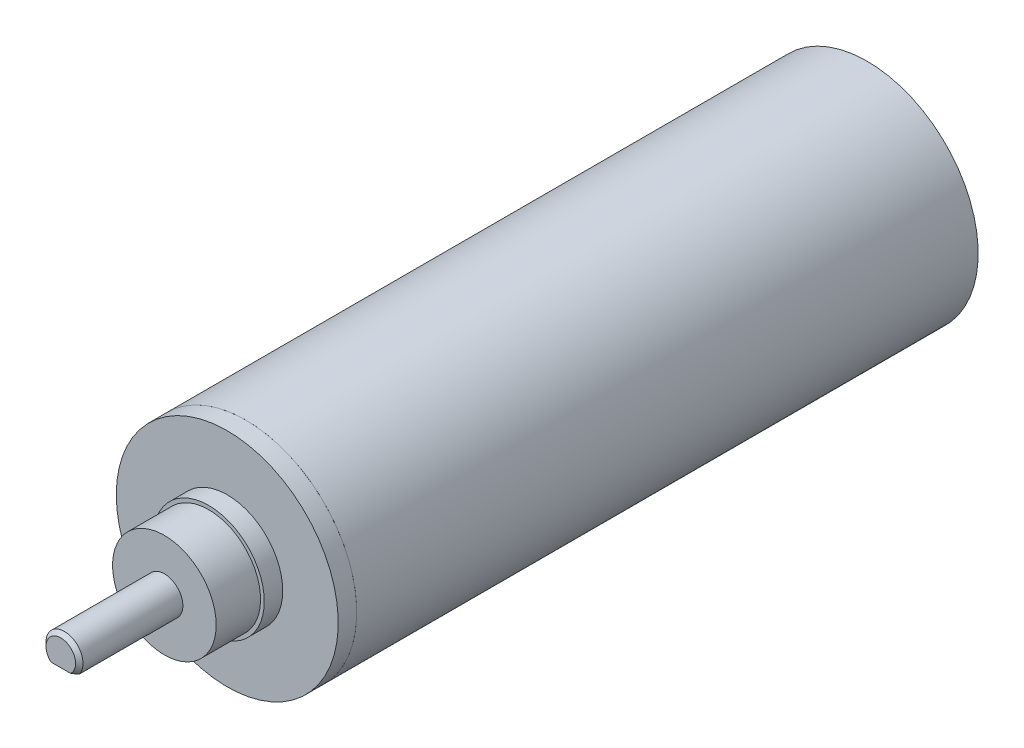
ISO-10303-21;
HEADER;
FILE_DESCRIPTION(('STEP AP214'),'2;1');
FILE_NAME('part.step','',(''),(''),'','','');
FILE_SCHEMA(('AUTOMOTIVE_DESIGN { 1 0 10303 214 1 1 1 1 }'));
ENDSEC;
DATA;
#1=APPLICATION_CONTEXT('core data for automotive mechanical design processes');
#2=APPLICATION_PROTOCOL_DEFINITION('international standard','automotive_design',2000,#1);
#3=PRODUCT_CONTEXT('',#1,'mechanical');
#4=PRODUCT('Part','Part','',(#3));
#5=PRODUCT_RELATED_PRODUCT_CATEGORY('part','',(#4));
#6=PRODUCT_DEFINITION_FORMATION('','',#4);
#7=PRODUCT_DEFINITION_CONTEXT('part definition',#1,'design');
#8=PRODUCT_DEFINITION('design','',#6,#7);
#9=PRODUCT_DEFINITION_SHAPE('','',#8);
#10=(LENGTH_UNIT() NAMED_UNIT(*) SI_UNIT(.MILLI.,.METRE.));
#11=(NAMED_UNIT(*) PLANE_ANGLE_UNIT() SI_UNIT($,.RADIAN.));
#12=(NAMED_UNIT(*) SI_UNIT($,.STERADIAN.) SOLID_ANGLE_UNIT());
#13=UNCERTAINTY_MEASURE_WITH_UNIT(LENGTH_MEASURE(1.E-05),#10,'distance_accuracy_value','');
#14=(GEOMETRIC_REPRESENTATION_CONTEXT(3) GLOBAL_UNCERTAINTY_ASSIGNED_CONTEXT((#13)) GLOBAL_UNIT_ASSIGNED_CONTEXT((#10,
#11,#12)) REPRESENTATION_CONTEXT('',''));
#15=CARTESIAN_POINT('',(0.,0.,0.));
#16=DIRECTION('',(0.,0.,1.));
#17=DIRECTION('',(1.,0.,0.));
#18=AXIS2_PLACEMENT_3D('',#15,#16,#17);
#19=CARTESIAN_POINT('',(0.,0.,-13.4));
#20=DIRECTION('',(0.,0.,1.));
#21=DIRECTION('',(1.,0.,0.));
#22=AXIS2_PLACEMENT_3D('',#19,#20,#21);
#23=CYLINDRICAL_SURFACE('',#22,1.4);
#24=CARTESIAN_POINT('',(0.,0.,-14.4919408480311));
#25=DIRECTION('',(0.,0.,1.));
#26=DIRECTION('',(-1.,0.,0.));
#27=AXIS2_PLACEMENT_3D('',#24,#25,#26);
#28=CIRCLE('',#27,1.4);
#29=CARTESIAN_POINT('',(-1.4,0.,-14.4919408480311));
#30=VERTEX_POINT('',#29);
#31=EDGE_CURVE('E39',#30,#30,#28,.T.);
#32=ORIENTED_EDGE('',*,*,#31,.F.);
#33=EDGE_LOOP('',(#32));
#34=FACE_BOUND('',#33,.T.);
#35=CARTESIAN_POINT('',(0.,0.,-13.5));
#36=DIRECTION('',(0.,0.,-1.));
#37=DIRECTION('',(1.,0.,0.));
#38=AXIS2_PLACEMENT_3D('',#35,#36,#37);
#39=CIRCLE('',#38,1.4);
#40=CARTESIAN_POINT('',(1.4,0.,-13.5));
#41=VERTEX_POINT('',#40);
#42=EDGE_CURVE('E195',#41,#41,#39,.T.);
#43=ORIENTED_EDGE('',*,*,#42,.F.);
#44=EDGE_LOOP('',(#43));
#45=FACE_BOUND('',#44,.T.);
#46=ADVANCED_FACE('F16',(#34,#45),#23,.F.);
#47=CARTESIAN_POINT('',(0.,0.,4.5));
#48=DIRECTION('',(0.,0.,-1.));
#49=DIRECTION('',(0.,-1.,0.));
#50=AXIS2_PLACEMENT_3D('',#47,#48,#49);
#51=PLANE('',#50);
#52=DIRECTION('',(-1.,0.,0.));
#53=VECTOR('',#52,1.);
#54=CARTESIAN_POINT('',(0.5,-0.3,4.5));
#55=LINE('',#54,#53);
#56=CARTESIAN_POINT('',(0.264575131106459,-0.3,4.5));
#57=VERTEX_POINT('',#56);
#58=CARTESIAN_POINT('',(-0.264575131106459,-0.3,4.5));
#59=VERTEX_POINT('',#58);
#60=EDGE_CURVE('E91',#57,#59,#55,.T.);
#61=ORIENTED_EDGE('',*,*,#60,.F.);
#62=CARTESIAN_POINT('',(0.,0.,4.5));
#63=DIRECTION('',(0.,0.,1.));
#64=DIRECTION('',(-1.,0.,0.));
#65=AXIS2_PLACEMENT_3D('',#62,#63,#64);
#66=CIRCLE('',#65,0.4);
#67=EDGE_CURVE('E11',#57,#59,#66,.T.);
#68=ORIENTED_EDGE('',*,*,#67,.T.);
#69=EDGE_LOOP('',(#61,#68));
#70=FACE_BOUND('',#69,.T.);
#71=ADVANCED_FACE('F343',(#70),#51,.F.);
#72=CARTESIAN_POINT('',(0.,0.,0.));
#73=DIRECTION('',(0.,0.,-1.));
#74=DIRECTION('',(-1.,0.,0.));
#75=AXIS2_PLACEMENT_3D('',#72,#73,#74);
#76=CYLINDRICAL_SURFACE('',#75,3.);
#77=CARTESIAN_POINT('',(0.,0.,0.));
#78=DIRECTION('',(0.,0.,-1.));
#79=DIRECTION('',(-1.,0.,0.));
#80=AXIS2_PLACEMENT_3D('',#77,#78,#79);
#81=CIRCLE('',#80,3.);
#82=CARTESIAN_POINT('',(-3.,0.,0.));
#83=VERTEX_POINT('',#82);
#84=EDGE_CURVE('E27',#83,#83,#81,.T.);
#85=ORIENTED_EDGE('',*,*,#84,.T.);
#86=EDGE_LOOP('',(#85));
#87=FACE_BOUND('',#86,.T.);
#88=CARTESIAN_POINT('',(0.,0.,-0.499));
#89=DIRECTION('',(0.,0.,1.));
#90=DIRECTION('',(-1.,0.,0.));
#91=AXIS2_PLACEMENT_3D('',#88,#89,#90);
#92=CIRCLE('',#91,3.);
#93=CARTESIAN_POINT('',(-3.,0.,-0.499));
#94=VERTEX_POINT('',#93);
#95=EDGE_CURVE('E217',#94,#94,#92,.T.);
#96=ORIENTED_EDGE('',*,*,#95,.T.);
#97=EDGE_LOOP('',(#96));
#98=FACE_BOUND('',#97,.T.);
#99=ADVANCED_FACE('F345',(#87,#98),#76,.T.);
#100=CARTESIAN_POINT('',(0.,0.,0.5));
#101=DIRECTION('',(0.,0.,1.));
#102=DIRECTION('',(1.,0.,0.));
#103=AXIS2_PLACEMENT_3D('',#100,#101,#102);
#104=PLANE('',#103);
#105=CARTESIAN_POINT('',(0.,0.,0.5));
#106=DIRECTION('',(0.,0.,1.));
#107=DIRECTION('',(1.,0.,0.));
#108=AXIS2_PLACEMENT_3D('',#105,#106,#107);
#109=CIRCLE('',#108,1.4);
#110=CARTESIAN_POINT('',(1.4,0.,0.5));
#111=VERTEX_POINT('',#110);
#112=EDGE_CURVE('E232',#111,#111,#109,.T.);
#113=ORIENTED_EDGE('',*,*,#112,.F.);
#114=EDGE_LOOP('',(#113));
#115=FACE_BOUND('',#114,.T.);
#116=CARTESIAN_POINT('',(0.,0.,0.5));
#117=DIRECTION('',(0.,0.,-1.));
#118=DIRECTION('',(-1.,0.,0.));
#119=AXIS2_PLACEMENT_3D('',#116,#117,#118);
#120=CIRCLE('',#119,1.5);
#121=CARTESIAN_POINT('',(-1.5,0.,0.5));
#122=VERTEX_POINT('',#121);
#123=EDGE_CURVE('E221',#122,#122,#120,.T.);
#124=ORIENTED_EDGE('',*,*,#123,.F.);
#125=EDGE_LOOP('',(#124));
#126=FACE_BOUND('',#125,.T.);
#127=ADVANCED_FACE('F352',(#115,#126),#104,.T.);
#128=CARTESIAN_POINT('',(0.,0.,0.));
#129=DIRECTION('',(0.,0.,1.));
#130=DIRECTION('',(1.,0.,0.));
#131=AXIS2_PLACEMENT_3D('',#128,#129,#130);
#132=CYLINDRICAL_SURFACE('',#131,1.5);
#133=ORIENTED_EDGE('',*,*,#123,.T.);
#134=EDGE_LOOP('',(#133));
#135=FACE_BOUND('',#134,.T.);
#136=CARTESIAN_POINT('',(0.,0.,0.));
#137=DIRECTION('',(0.,0.,-1.));
#138=DIRECTION('',(1.,0.,0.));
#139=AXIS2_PLACEMENT_3D('',#136,#137,#138);
#140=CIRCLE('',#139,1.5);
#141=CARTESIAN_POINT('',(1.5,0.,0.));
#142=VERTEX_POINT('',#141);
#143=EDGE_CURVE('E239',#142,#142,#140,.T.);
#144=ORIENTED_EDGE('',*,*,#143,.F.);
#145=EDGE_LOOP('',(#144));
#146=FACE_BOUND('',#145,.T.);
#147=ADVANCED_FACE('F358',(#135,#146),#132,.T.);
#148=CARTESIAN_POINT('',(0.,0.,0.));
#149=DIRECTION('',(0.,0.,1.));
#150=DIRECTION('',(1.,0.,0.));
#151=AXIS2_PLACEMENT_3D('',#148,#149,#150);
#152=PLANE('',#151);
#153=ORIENTED_EDGE('',*,*,#143,.T.);
#154=EDGE_LOOP('',(#153));
#155=FACE_BOUND('',#154,.T.);
#156=ORIENTED_EDGE('',*,*,#84,.F.);
#157=EDGE_LOOP('',(#156));
#158=FACE_BOUND('',#157,.T.);
#159=ADVANCED_FACE('F359',(#155,#158),#152,.T.);
#160=CARTESIAN_POINT('',(0.,0.,-0.4995));
#161=DIRECTION('',(0.,0.,-1.));
#162=DIRECTION('',(-1.,0.,0.));
#163=AXIS2_PLACEMENT_3D('',#160,#161,#162);
#164=CYLINDRICAL_SURFACE('',#163,2.995);
#165=CARTESIAN_POINT('',(0.,0.,-0.5));
#166=DIRECTION('',(0.,0.,-1.));
#167=DIRECTION('',(-1.,0.,0.));
#168=AXIS2_PLACEMENT_3D('',#165,#166,#167);
#169=CIRCLE('',#168,2.995);
#170=CARTESIAN_POINT('',(-2.995,0.,-0.5));
#171=VERTEX_POINT('',#170);
#172=EDGE_CURVE('E183',#171,#171,#169,.T.);
#173=ORIENTED_EDGE('',*,*,#172,.F.);
#174=EDGE_LOOP('',(#173));
#175=FACE_BOUND('',#174,.T.);
#176=CARTESIAN_POINT('',(0.,0.,-0.499));
#177=DIRECTION('',(0.,0.,-1.));
#178=DIRECTION('',(-1.,0.,0.));
#179=AXIS2_PLACEMENT_3D('',#176,#177,#178);
#180=CIRCLE('',#179,2.995);
#181=CARTESIAN_POINT('',(-2.995,0.,-0.499));
#182=VERTEX_POINT('',#181);
#183=EDGE_CURVE('E181',#182,#182,#180,.T.);
#184=ORIENTED_EDGE('',*,*,#183,.T.);
#185=EDGE_LOOP('',(#184));
#186=FACE_BOUND('',#185,.T.);
#187=ADVANCED_FACE('F362',(#175,#186),#164,.T.);
#188=CARTESIAN_POINT('',(0.,0.,-0.499));
#189=DIRECTION('',(0.,0.,-1.));
#190=DIRECTION('',(0.,-1.,0.));
#191=AXIS2_PLACEMENT_3D('',#188,#189,#190);
#192=PLANE('',#191);
#193=ORIENTED_EDGE('',*,*,#95,.F.);
#194=EDGE_LOOP('',(#193));
#195=FACE_BOUND('',#194,.T.);
#196=ORIENTED_EDGE('',*,*,#183,.F.);
#197=EDGE_LOOP('',(#196));
#198=FACE_BOUND('',#197,.T.);
#199=ADVANCED_FACE('F366',(#195,#198),#192,.T.);
#200=CARTESIAN_POINT('',(0.,0.,-0.5));
#201=DIRECTION('',(0.,0.,-1.));
#202=DIRECTION('',(0.,-1.,0.));
#203=AXIS2_PLACEMENT_3D('',#200,#201,#202);
#204=PLANE('',#203);
#205=CARTESIAN_POINT('',(0.,0.,-0.5));
#206=DIRECTION('',(0.,0.,1.));
#207=DIRECTION('',(-1.,0.,0.));
#208=AXIS2_PLACEMENT_3D('',#205,#206,#207);
#209=CIRCLE('',#208,3.);
#210=CARTESIAN_POINT('',(-3.,0.,-0.5));
#211=VERTEX_POINT('',#210);
#212=EDGE_CURVE('E186',#211,#211,#209,.T.);
#213=ORIENTED_EDGE('',*,*,#212,.T.);
#214=EDGE_LOOP('',(#213));
#215=FACE_BOUND('',#214,.T.);
#216=ORIENTED_EDGE('',*,*,#172,.T.);
#217=EDGE_LOOP('',(#216));
#218=FACE_BOUND('',#217,.T.);
#219=ADVANCED_FACE('F412',(#215,#218),#204,.F.);
#220=CARTESIAN_POINT('',(0.,0.,-17.3));
#221=DIRECTION('',(0.,0.,-1.));
#222=DIRECTION('',(0.,-1.,0.));
#223=AXIS2_PLACEMENT_3D('',#220,#221,#222);
#224=PLANE('',#223);
#225=CARTESIAN_POINT('',(0.,0.,-17.3));
#226=DIRECTION('',(0.,0.,-1.));
#227=DIRECTION('',(-1.,0.,0.));
#228=AXIS2_PLACEMENT_3D('',#225,#226,#227);
#229=CIRCLE('',#228,2.5);
#230=CARTESIAN_POINT('',(-2.5,0.,-17.3));
#231=VERTEX_POINT('',#230);
#232=EDGE_CURVE('E164',#231,#231,#229,.T.);
#233=ORIENTED_EDGE('',*,*,#232,.F.);
#234=EDGE_LOOP('',(#233));
#235=FACE_BOUND('',#234,.T.);
#236=CARTESIAN_POINT('',(0.,0.,-17.3));
#237=DIRECTION('',(0.,0.,-1.));
#238=DIRECTION('',(-1.,0.,0.));
#239=AXIS2_PLACEMENT_3D('',#236,#237,#238);
#240=CIRCLE('',#239,3.);
#241=CARTESIAN_POINT('',(-3.,0.,-17.3));
#242=VERTEX_POINT('',#241);
#243=EDGE_CURVE('E187',#242,#242,#240,.T.);
#244=ORIENTED_EDGE('',*,*,#243,.T.);
#245=EDGE_LOOP('',(#244));
#246=FACE_BOUND('',#245,.T.);
#247=ADVANCED_FACE('F165',(#235,#246),#224,.T.);
#248=CARTESIAN_POINT('',(0.,0.,0.));
#249=DIRECTION('',(0.,0.,-1.));
#250=DIRECTION('',(-1.,0.,0.));
#251=AXIS2_PLACEMENT_3D('',#248,#249,#250);
#252=CYLINDRICAL_SURFACE('',#251,3.);
#253=ORIENTED_EDGE('',*,*,#212,.F.);
#254=EDGE_LOOP('',(#253));
#255=FACE_BOUND('',#254,.T.);
#256=ORIENTED_EDGE('',*,*,#243,.F.);
#257=EDGE_LOOP('',(#256));
#258=FACE_BOUND('',#257,.T.);
#259=ADVANCED_FACE('F447',(#255,#258),#252,.T.);
#260=CARTESIAN_POINT('',(0.,0.,1.7));
#261=DIRECTION('',(0.,0.,1.));
#262=DIRECTION('',(1.,0.,0.));
#263=AXIS2_PLACEMENT_3D('',#260,#261,#262);
#264=PLANE('',#263);
#265=CARTESIAN_POINT('',(0.,0.,1.7));
#266=DIRECTION('',(0.,0.,1.));
#267=DIRECTION('',(1.,0.,0.));
#268=AXIS2_PLACEMENT_3D('',#265,#266,#267);
#269=CIRCLE('',#268,0.5);
#270=CARTESIAN_POINT('',(0.5,0.,1.7));
#271=VERTEX_POINT('',#270);
#272=EDGE_CURVE('E233',#271,#271,#269,.T.);
#273=ORIENTED_EDGE('',*,*,#272,.F.);
#274=EDGE_LOOP('',(#273));
#275=FACE_BOUND('',#274,.T.);
#276=CARTESIAN_POINT('',(0.,0.,1.7));
#277=DIRECTION('',(0.,0.,1.));
#278=DIRECTION('',(1.,0.,0.));
#279=AXIS2_PLACEMENT_3D('',#276,#277,#278);
#280=CIRCLE('',#279,1.4);
#281=CARTESIAN_POINT('',(1.4,0.,1.7));
#282=VERTEX_POINT('',#281);
#283=EDGE_CURVE('E228',#282,#282,#280,.T.);
#284=ORIENTED_EDGE('',*,*,#283,.T.);
#285=EDGE_LOOP('',(#284));
#286=FACE_BOUND('',#285,.T.);
#287=ADVANCED_FACE('F425',(#275,#286),#264,.T.);
#288=CARTESIAN_POINT('',(0.,0.,0.));
#289=DIRECTION('',(0.,0.,1.));
#290=DIRECTION('',(1.,0.,0.));
#291=AXIS2_PLACEMENT_3D('',#288,#289,#290);
#292=CYLINDRICAL_SURFACE('',#291,1.4);
#293=ORIENTED_EDGE('',*,*,#112,.T.);
#294=EDGE_LOOP('',(#293));
#295=FACE_BOUND('',#294,.T.);
#296=ORIENTED_EDGE('',*,*,#283,.F.);
#297=EDGE_LOOP('',(#296));
#298=FACE_BOUND('',#297,.T.);
#299=ADVANCED_FACE('F423',(#295,#298),#292,.T.);
#300=CARTESIAN_POINT('',(0.,0.,4.5));
#301=DIRECTION('',(0.,0.,-1.));
#302=DIRECTION('',(-1.,0.,0.));
#303=AXIS2_PLACEMENT_3D('',#300,#301,#302);
#304=CYLINDRICAL_SURFACE('',#303,0.5);
#305=DIRECTION('',(0.,0.,-1.));
#306=VECTOR('',#305,1.);
#307=CARTESIAN_POINT('',(-0.4,-0.3,4.5));
#308=LINE('',#307,#306);
#309=CARTESIAN_POINT('',(-0.4,-0.3,4.4));
#310=VERTEX_POINT('',#309);
#311=CARTESIAN_POINT('',(-0.4,-0.3,2.5));
#312=VERTEX_POINT('',#311);
#313=EDGE_CURVE('E200',#310,#312,#308,.T.);
#314=ORIENTED_EDGE('',*,*,#313,.F.);
#315=CARTESIAN_POINT('',(0.,0.,4.4));
#316=DIRECTION('',(0.,0.,-1.));
#317=DIRECTION('',(-1.,0.,0.));
#318=AXIS2_PLACEMENT_3D('',#315,#316,#317);
#319=CIRCLE('',#318,0.5);
#320=CARTESIAN_POINT('',(0.4,-0.3,4.4));
#321=VERTEX_POINT('',#320);
#322=EDGE_CURVE('E237',#310,#321,#319,.T.);
#323=ORIENTED_EDGE('',*,*,#322,.T.);
#324=DIRECTION('',(0.,0.,1.));
#325=VECTOR('',#324,1.);
#326=CARTESIAN_POINT('',(0.4,-0.3,4.5));
#327=LINE('',#326,#325);
#328=CARTESIAN_POINT('',(0.4,-0.3,2.5));
#329=VERTEX_POINT('',#328);
#330=EDGE_CURVE('E238',#329,#321,#327,.T.);
#331=ORIENTED_EDGE('',*,*,#330,.F.);
#332=CARTESIAN_POINT('',(0.,0.,2.5));
#333=DIRECTION('',(0.,0.,1.));
#334=DIRECTION('',(0.,1.,0.));
#335=AXIS2_PLACEMENT_3D('',#332,#333,#334);
#336=CIRCLE('',#335,0.5);
#337=EDGE_CURVE('E201',#312,#329,#336,.T.);
#338=ORIENTED_EDGE('',*,*,#337,.F.);
#339=EDGE_LOOP('',(#314,#323,#331,#338));
#340=FACE_BOUND('',#339,.T.);
#341=ORIENTED_EDGE('',*,*,#272,.T.);
#342=EDGE_LOOP('',(#341));
#343=FACE_BOUND('',#342,.T.);
#344=ADVANCED_FACE('F265',(#340,#343),#304,.T.);
#345=CARTESIAN_POINT('',(0.5,-0.3,4.5));
#346=DIRECTION('',(0.,1.,0.));
#347=DIRECTION('',(1.,0.,0.));
#348=AXIS2_PLACEMENT_3D('',#345,#346,#347);
#349=PLANE('',#348);
#350=ORIENTED_EDGE('',*,*,#330,.T.);
#351=CARTESIAN_POINT('',(0.4,-0.3,4.4));
#352=CARTESIAN_POINT('',(0.324763961725768,-0.3,4.46018883061938));
#353=CARTESIAN_POINT('',(0.264575131106459,-0.3,4.5));
#354=B_SPLINE_CURVE_WITH_KNOTS('',2,(#351,#352,#353),.UNSPECIFIED.,.F.,.F.,(3,3),(0.,1.),.UNSPECIFIED.);
#355=EDGE_CURVE('E248',#321,#57,#354,.T.);
#356=ORIENTED_EDGE('',*,*,#355,.T.);
#357=ORIENTED_EDGE('',*,*,#60,.T.);
#358=CARTESIAN_POINT('',(-0.264575131106459,-0.3,4.5));
#359=CARTESIAN_POINT('',(-0.324763961725768,-0.3,4.46018883061938));
#360=CARTESIAN_POINT('',(-0.4,-0.3,4.4));
#361=B_SPLINE_CURVE_WITH_KNOTS('',2,(#358,#359,#360),.UNSPECIFIED.,.F.,.F.,(3,3),(0.,1.),.UNSPECIFIED.);
#362=EDGE_CURVE('E285',#59,#310,#361,.T.);
#363=ORIENTED_EDGE('',*,*,#362,.T.);
#364=ORIENTED_EDGE('',*,*,#313,.T.);
#365=DIRECTION('',(-1.,0.,0.));
#366=VECTOR('',#365,1.);
#367=CARTESIAN_POINT('',(0.5,-0.3,2.5));
#368=LINE('',#367,#366);
#369=EDGE_CURVE('E196',#329,#312,#368,.T.);
#370=ORIENTED_EDGE('',*,*,#369,.F.);
#371=EDGE_LOOP('',(#350,#356,#357,#363,#364,#370));
#372=FACE_BOUND('',#371,.T.);
#373=ADVANCED_FACE('F254',(#372),#349,.F.);
#374=CARTESIAN_POINT('',(0.5,-0.3,2.5));
#375=DIRECTION('',(0.,0.,-1.));
#376=DIRECTION('',(-1.,0.,0.));
#377=AXIS2_PLACEMENT_3D('',#374,#375,#376);
#378=PLANE('',#377);
#379=ORIENTED_EDGE('',*,*,#369,.T.);
#380=ORIENTED_EDGE('',*,*,#337,.T.);
#381=EDGE_LOOP('',(#379,#380));
#382=FACE_BOUND('',#381,.T.);
#383=ADVANCED_FACE('F264',(#382),#378,.F.);
#384=CARTESIAN_POINT('',(0.,0.,4.4));
#385=DIRECTION('',(0.,0.,-1.));
#386=DIRECTION('',(-1.,0.,0.));
#387=AXIS2_PLACEMENT_3D('',#384,#385,#386);
#388=CONICAL_SURFACE('',#387,0.5,0.785398162499998);
#389=ORIENTED_EDGE('',*,*,#362,.F.);
#390=ORIENTED_EDGE('',*,*,#67,.F.);
#391=ORIENTED_EDGE('',*,*,#355,.F.);
#392=ORIENTED_EDGE('',*,*,#322,.F.);
#393=EDGE_LOOP('',(#389,#390,#391,#392));
#394=FACE_BOUND('',#393,.T.);
#395=ADVANCED_FACE('F289',(#394),#388,.T.);
#396=CARTESIAN_POINT('',(0.,0.,-16.8));
#397=DIRECTION('',(0.,0.,-1.));
#398=DIRECTION('',(0.,-1.,0.));
#399=AXIS2_PLACEMENT_3D('',#396,#397,#398);
#400=PLANE('',#399);
#401=CARTESIAN_POINT('',(0.,0.,-16.8));
#402=DIRECTION('',(0.,0.,1.));
#403=DIRECTION('',(-1.,0.,0.));
#404=AXIS2_PLACEMENT_3D('',#401,#402,#403);
#405=CIRCLE('',#404,2.329375);
#406=CARTESIAN_POINT('',(-2.329375,0.,-16.8));
#407=VERTEX_POINT('',#406);
#408=EDGE_CURVE('E175',#407,#407,#405,.T.);
#409=ORIENTED_EDGE('',*,*,#408,.T.);
#410=EDGE_LOOP('',(#409));
#411=FACE_BOUND('',#410,.T.);
#412=CARTESIAN_POINT('',(0.,0.,-16.8));
#413=DIRECTION('',(0.,0.,-1.));
#414=DIRECTION('',(-1.,0.,0.));
#415=AXIS2_PLACEMENT_3D('',#412,#413,#414);
#416=CIRCLE('',#415,2.5);
#417=CARTESIAN_POINT('',(-2.5,0.,-16.8));
#418=VERTEX_POINT('',#417);
#419=EDGE_CURVE('E137',#418,#418,#416,.T.);
#420=ORIENTED_EDGE('',*,*,#419,.T.);
#421=EDGE_LOOP('',(#420));
#422=FACE_BOUND('',#421,.T.);
#423=ADVANCED_FACE('F299',(#411,#422),#400,.T.);
#424=CARTESIAN_POINT('',(0.,0.,-17.05));
#425=DIRECTION('',(0.,0.,-1.));
#426=DIRECTION('',(-1.,0.,0.));
#427=AXIS2_PLACEMENT_3D('',#424,#425,#426);
#428=CYLINDRICAL_SURFACE('',#427,2.5);
#429=ORIENTED_EDGE('',*,*,#232,.T.);
#430=EDGE_LOOP('',(#429));
#431=FACE_BOUND('',#430,.T.);
#432=ORIENTED_EDGE('',*,*,#419,.F.);
#433=EDGE_LOOP('',(#432));
#434=FACE_BOUND('',#433,.T.);
#435=ADVANCED_FACE('F421',(#431,#434),#428,.F.);
#436=CARTESIAN_POINT('',(0.,0.,-14.8));
#437=DIRECTION('',(0.,0.,-1.));
#438=DIRECTION('',(1.,0.,0.));
#439=AXIS2_PLACEMENT_3D('',#436,#437,#438);
#440=CONICAL_SURFACE('',#439,1.979375,1.082104135);
#441=ORIENTED_EDGE('',*,*,#31,.T.);
#442=EDGE_LOOP('',(#441));
#443=FACE_BOUND('',#442,.T.);
#444=CARTESIAN_POINT('',(0.,0.,-14.8));
#445=DIRECTION('',(0.,0.,1.));
#446=DIRECTION('',(1.,0.,0.));
#447=AXIS2_PLACEMENT_3D('',#444,#445,#446);
#448=CIRCLE('',#447,1.979375);
#449=CARTESIAN_POINT('',(1.979375,0.,-14.8));
#450=VERTEX_POINT('',#449);
#451=EDGE_CURVE('E146',#450,#450,#448,.T.);
#452=ORIENTED_EDGE('',*,*,#451,.F.);
#453=EDGE_LOOP('',(#452));
#454=FACE_BOUND('',#453,.T.);
#455=ADVANCED_FACE('F432',(#443,#454),#440,.F.);
#456=CARTESIAN_POINT('',(0.,0.,-17.3));
#457=DIRECTION('',(0.,0.,1.));
#458=DIRECTION('',(1.,0.,0.));
#459=AXIS2_PLACEMENT_3D('',#456,#457,#458);
#460=CYLINDRICAL_SURFACE('',#459,1.979375);
#461=CARTESIAN_POINT('',(0.,0.,-16.45));
#462=DIRECTION('',(0.,0.,-1.));
#463=DIRECTION('',(-1.,0.,0.));
#464=AXIS2_PLACEMENT_3D('',#461,#462,#463);
#465=CIRCLE('',#464,1.979375);
#466=CARTESIAN_POINT('',(-1.979375,0.,-16.45));
#467=VERTEX_POINT('',#466);
#468=EDGE_CURVE('E177',#467,#467,#465,.T.);
#469=ORIENTED_EDGE('',*,*,#468,.T.);
#470=EDGE_LOOP('',(#469));
#471=FACE_BOUND('',#470,.T.);
#472=ORIENTED_EDGE('',*,*,#451,.T.);
#473=EDGE_LOOP('',(#472));
#474=FACE_BOUND('',#473,.T.);
#475=ADVANCED_FACE('F380',(#471,#474),#460,.F.);
#476=CARTESIAN_POINT('',(0.,0.,-16.8));
#477=DIRECTION('',(0.,0.,-1.));
#478=DIRECTION('',(-1.,0.,0.));
#479=AXIS2_PLACEMENT_3D('',#476,#477,#478);
#480=CONICAL_SURFACE('',#479,2.329375,0.7853981625);
#481=ORIENTED_EDGE('',*,*,#468,.F.);
#482=EDGE_LOOP('',(#481));
#483=FACE_BOUND('',#482,.T.);
#484=ORIENTED_EDGE('',*,*,#408,.F.);
#485=EDGE_LOOP('',(#484));
#486=FACE_BOUND('',#485,.T.);
#487=ADVANCED_FACE('F373',(#483,#486),#480,.F.);
#488=CARTESIAN_POINT('',(0.,0.,-13.5));
#489=DIRECTION('',(0.,0.,1.));
#490=DIRECTION('',(1.,0.,0.));
#491=AXIS2_PLACEMENT_3D('',#488,#489,#490);
#492=PLANE('',#491);
#493=CARTESIAN_POINT('',(0.,0.,-13.5));
#494=DIRECTION('',(0.,0.,1.));
#495=DIRECTION('',(-1.,0.,0.));
#496=AXIS2_PLACEMENT_3D('',#493,#494,#495);
#497=CIRCLE('',#496,1.175);
#498=CARTESIAN_POINT('',(-1.175,0.,-13.5));
#499=VERTEX_POINT('',#498);
#500=EDGE_CURVE('E191',#499,#499,#497,.T.);
#501=ORIENTED_EDGE('',*,*,#500,.T.);
#502=EDGE_LOOP('',(#501));
#503=FACE_BOUND('',#502,.T.);
#504=ORIENTED_EDGE('',*,*,#42,.T.);
#505=EDGE_LOOP('',(#504));
#506=FACE_BOUND('',#505,.T.);
#507=ADVANCED_FACE('F371',(#503,#506),#492,.F.);
#508=CARTESIAN_POINT('',(0.,0.,-13.5));
#509=DIRECTION('',(0.,0.,1.));
#510=DIRECTION('',(1.,0.,0.));
#511=AXIS2_PLACEMENT_3D('',#508,#509,#510);
#512=CYLINDRICAL_SURFACE('',#511,1.175);
#513=ORIENTED_EDGE('',*,*,#500,.F.);
#514=EDGE_LOOP('',(#513));
#515=FACE_BOUND('',#514,.T.);
#516=CARTESIAN_POINT('',(0.,0.,-13.4));
#517=DIRECTION('',(0.,0.,1.));
#518=DIRECTION('',(-1.,0.,0.));
#519=AXIS2_PLACEMENT_3D('',#516,#517,#518);
#520=CIRCLE('',#519,1.175);
#521=CARTESIAN_POINT('',(-1.175,0.,-13.4));
#522=VERTEX_POINT('',#521);
#523=EDGE_CURVE('E208',#522,#522,#520,.T.);
#524=ORIENTED_EDGE('',*,*,#523,.T.);
#525=EDGE_LOOP('',(#524));
#526=FACE_BOUND('',#525,.T.);
#527=ADVANCED_FACE('F18',(#515,#526),#512,.F.);
#528=CARTESIAN_POINT('',(0.,0.,-11.8));
#529=DIRECTION('',(0.,0.,1.));
#530=DIRECTION('',(1.,0.,0.));
#531=AXIS2_PLACEMENT_3D('',#528,#529,#530);
#532=PLANE('',#531);
#533=CARTESIAN_POINT('',(0.,0.,-11.8));
#534=DIRECTION('',(0.,0.,1.));
#535=DIRECTION('',(1.,0.,0.));
#536=AXIS2_PLACEMENT_3D('',#533,#534,#535);
#537=CIRCLE('',#536,0.975);
#538=CARTESIAN_POINT('',(0.975,0.,-11.8));
#539=VERTEX_POINT('',#538);
#540=EDGE_CURVE('E209',#539,#539,#537,.T.);
#541=ORIENTED_EDGE('',*,*,#540,.F.);
#542=EDGE_LOOP('',(#541));
#543=FACE_BOUND('',#542,.T.);
#544=ADVANCED_FACE('F368',(#543),#532,.F.);
#545=CARTESIAN_POINT('',(0.,0.,-17.3));
#546=DIRECTION('',(0.,0.,1.));
#547=DIRECTION('',(1.,0.,0.));
#548=AXIS2_PLACEMENT_3D('',#545,#546,#547);
#549=CYLINDRICAL_SURFACE('',#548,0.975);
#550=ORIENTED_EDGE('',*,*,#540,.T.);
#551=EDGE_LOOP('',(#550));
#552=FACE_BOUND('',#551,.T.);
#553=CARTESIAN_POINT('',(0.,0.,-13.4));
#554=DIRECTION('',(0.,0.,1.));
#555=DIRECTION('',(1.,0.,0.));
#556=AXIS2_PLACEMENT_3D('',#553,#554,#555);
#557=CIRCLE('',#556,0.975);
#558=CARTESIAN_POINT('',(0.975,0.,-13.4));
#559=VERTEX_POINT('',#558);
#560=EDGE_CURVE('E213',#559,#559,#557,.T.);
#561=ORIENTED_EDGE('',*,*,#560,.F.);
#562=EDGE_LOOP('',(#561));
#563=FACE_BOUND('',#562,.T.);
#564=ADVANCED_FACE('F300',(#552,#563),#549,.F.);
#565=CARTESIAN_POINT('',(0.,0.,-13.4));
#566=DIRECTION('',(0.,0.,1.));
#567=DIRECTION('',(1.,0.,0.));
#568=AXIS2_PLACEMENT_3D('',#565,#566,#567);
#569=PLANE('',#568);
#570=ORIENTED_EDGE('',*,*,#560,.T.);
#571=EDGE_LOOP('',(#570));
#572=FACE_BOUND('',#571,.T.);
#573=ORIENTED_EDGE('',*,*,#523,.F.);
#574=EDGE_LOOP('',(#573));
#575=FACE_BOUND('',#574,.T.);
#576=ADVANCED_FACE('F266',(#572,#575),#569,.F.);
#577=CLOSED_SHELL('',(#46,#71,#99,#127,#147,#159,#187,#199,#219,#247,#259,#287,#299,#344,#373,
#383,#395,#423,#435,#455,#475,#487,#507,#527,#544,#564,#576));
#578=MANIFOLD_SOLID_BREP('B1',#577);
#579=ADVANCED_BREP_SHAPE_REPRESENTATION('',(#18,#578),#14);
#580=SHAPE_DEFINITION_REPRESENTATION(#9,#579);
ENDSEC;
END-ISO-10303-21;
